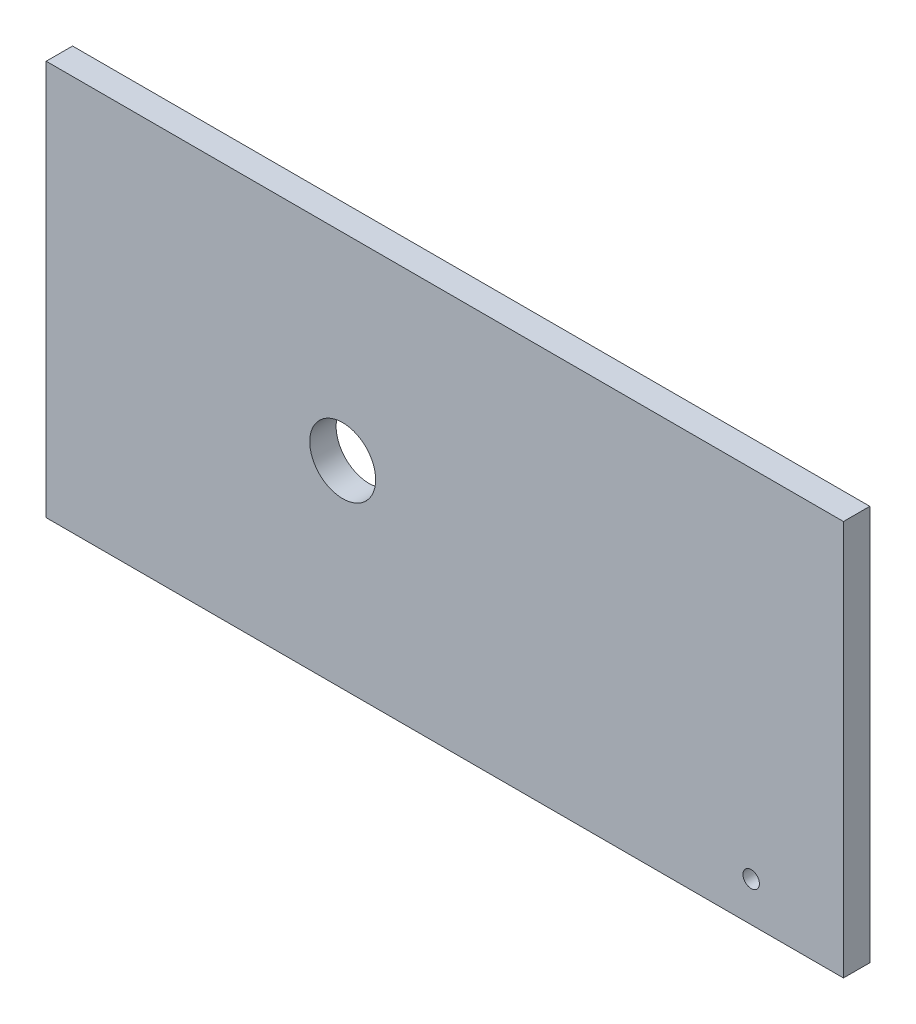
ISO-10303-21;
HEADER;
FILE_DESCRIPTION(('STEP AP214'),'2;1');
FILE_NAME('part.step','',(''),(''),'','','');
FILE_SCHEMA(('AUTOMOTIVE_DESIGN { 1 0 10303 214 1 1 1 1 }'));
ENDSEC;
DATA;
#1=APPLICATION_CONTEXT('core data for automotive mechanical design processes');
#2=APPLICATION_PROTOCOL_DEFINITION('international standard','automotive_design',2000,#1);
#3=PRODUCT_CONTEXT('',#1,'mechanical');
#4=PRODUCT('Part','Part','',(#3));
#5=PRODUCT_RELATED_PRODUCT_CATEGORY('part','',(#4));
#6=PRODUCT_DEFINITION_FORMATION('','',#4);
#7=PRODUCT_DEFINITION_CONTEXT('part definition',#1,'design');
#8=PRODUCT_DEFINITION('design','',#6,#7);
#9=PRODUCT_DEFINITION_SHAPE('','',#8);
#10=(LENGTH_UNIT() NAMED_UNIT(*) SI_UNIT(.MILLI.,.METRE.));
#11=(NAMED_UNIT(*) PLANE_ANGLE_UNIT() SI_UNIT($,.RADIAN.));
#12=(NAMED_UNIT(*) SI_UNIT($,.STERADIAN.) SOLID_ANGLE_UNIT());
#13=UNCERTAINTY_MEASURE_WITH_UNIT(LENGTH_MEASURE(1.E-05),#10,'distance_accuracy_value','');
#14=(GEOMETRIC_REPRESENTATION_CONTEXT(3) GLOBAL_UNCERTAINTY_ASSIGNED_CONTEXT((#13)) GLOBAL_UNIT_ASSIGNED_CONTEXT((#10,
#11,#12)) REPRESENTATION_CONTEXT('',''));
#15=CARTESIAN_POINT('',(0.,0.,0.));
#16=DIRECTION('',(0.,0.,1.));
#17=DIRECTION('',(1.,0.,0.));
#18=AXIS2_PLACEMENT_3D('',#15,#16,#17);
#19=CARTESIAN_POINT('',(0.,0.,4.));
#20=DIRECTION('',(0.,0.,1.));
#21=DIRECTION('',(1.,0.,0.));
#22=AXIS2_PLACEMENT_3D('',#19,#20,#21);
#23=PLANE('',#22);
#24=CARTESIAN_POINT('',(26.,-24.,4.));
#25=DIRECTION('',(0.,0.,1.));
#26=DIRECTION('',(1.,0.,0.));
#27=AXIS2_PLACEMENT_3D('',#24,#25,#26);
#28=CIRCLE('',#27,1.25);
#29=CARTESIAN_POINT('',(27.25,-24.,4.));
#30=VERTEX_POINT('',#29);
#31=EDGE_CURVE('E99',#30,#30,#28,.T.);
#32=ORIENTED_EDGE('',*,*,#31,.F.);
#33=EDGE_LOOP('',(#32));
#34=FACE_BOUND('',#33,.T.);
#35=DIRECTION('',(0.,1.,0.));
#36=VECTOR('',#35,1.);
#37=CARTESIAN_POINT('',(40.,30.,4.));
#38=LINE('',#37,#36);
#39=CARTESIAN_POINT('',(40.,-30.,4.));
#40=VERTEX_POINT('',#39);
#41=CARTESIAN_POINT('',(40.,30.,4.));
#42=VERTEX_POINT('',#41);
#43=EDGE_CURVE('E84',#40,#42,#38,.T.);
#44=ORIENTED_EDGE('',*,*,#43,.T.);
#45=DIRECTION('',(-1.,0.,0.));
#46=VECTOR('',#45,1.);
#47=CARTESIAN_POINT('',(-81.,30.,4.));
#48=LINE('',#47,#46);
#49=CARTESIAN_POINT('',(-81.,30.,4.));
#50=VERTEX_POINT('',#49);
#51=EDGE_CURVE('E79',#42,#50,#48,.T.);
#52=ORIENTED_EDGE('',*,*,#51,.T.);
#53=DIRECTION('',(0.,-1.,0.));
#54=VECTOR('',#53,1.);
#55=CARTESIAN_POINT('',(-81.,-30.,4.));
#56=LINE('',#55,#54);
#57=CARTESIAN_POINT('',(-81.,-30.,4.));
#58=VERTEX_POINT('',#57);
#59=EDGE_CURVE('E82',#50,#58,#56,.T.);
#60=ORIENTED_EDGE('',*,*,#59,.T.);
#61=DIRECTION('',(1.,0.,0.));
#62=VECTOR('',#61,1.);
#63=CARTESIAN_POINT('',(-81.,-30.,4.));
#64=LINE('',#63,#62);
#65=EDGE_CURVE('E49',#58,#40,#64,.T.);
#66=ORIENTED_EDGE('',*,*,#65,.T.);
#67=EDGE_LOOP('',(#44,#52,#60,#66));
#68=FACE_BOUND('',#67,.T.);
#69=CARTESIAN_POINT('',(-36.,0.,4.));
#70=DIRECTION('',(0.,0.,1.));
#71=DIRECTION('',(1.,0.,0.));
#72=AXIS2_PLACEMENT_3D('',#69,#70,#71);
#73=CIRCLE('',#72,5.);
#74=CARTESIAN_POINT('',(-31.,0.,4.));
#75=VERTEX_POINT('',#74);
#76=EDGE_CURVE('E114',#75,#75,#73,.T.);
#77=ORIENTED_EDGE('',*,*,#76,.F.);
#78=EDGE_LOOP('',(#77));
#79=FACE_BOUND('',#78,.T.);
#80=ADVANCED_FACE('F32',(#34,#68,#79),#23,.T.);
#81=CARTESIAN_POINT('',(0.,0.,0.));
#82=DIRECTION('',(0.,0.,1.));
#83=DIRECTION('',(1.,0.,0.));
#84=AXIS2_PLACEMENT_3D('',#81,#82,#83);
#85=PLANE('',#84);
#86=DIRECTION('',(0.,1.,0.));
#87=VECTOR('',#86,1.);
#88=CARTESIAN_POINT('',(40.,30.,0.));
#89=LINE('',#88,#87);
#90=CARTESIAN_POINT('',(40.,-30.,0.));
#91=VERTEX_POINT('',#90);
#92=CARTESIAN_POINT('',(40.,30.,0.));
#93=VERTEX_POINT('',#92);
#94=EDGE_CURVE('E96',#91,#93,#89,.T.);
#95=ORIENTED_EDGE('',*,*,#94,.F.);
#96=DIRECTION('',(1.,0.,0.));
#97=VECTOR('',#96,1.);
#98=CARTESIAN_POINT('',(-81.,-30.,0.));
#99=LINE('',#98,#97);
#100=CARTESIAN_POINT('',(-81.,-30.,0.));
#101=VERTEX_POINT('',#100);
#102=EDGE_CURVE('E72',#101,#91,#99,.T.);
#103=ORIENTED_EDGE('',*,*,#102,.F.);
#104=DIRECTION('',(0.,-1.,0.));
#105=VECTOR('',#104,1.);
#106=CARTESIAN_POINT('',(-81.,-30.,0.));
#107=LINE('',#106,#105);
#108=CARTESIAN_POINT('',(-81.,30.,0.));
#109=VERTEX_POINT('',#108);
#110=EDGE_CURVE('E66',#109,#101,#107,.T.);
#111=ORIENTED_EDGE('',*,*,#110,.F.);
#112=DIRECTION('',(-1.,0.,0.));
#113=VECTOR('',#112,1.);
#114=CARTESIAN_POINT('',(-81.,30.,0.));
#115=LINE('',#114,#113);
#116=EDGE_CURVE('E88',#93,#109,#115,.T.);
#117=ORIENTED_EDGE('',*,*,#116,.F.);
#118=EDGE_LOOP('',(#95,#103,#111,#117));
#119=FACE_BOUND('',#118,.T.);
#120=CARTESIAN_POINT('',(26.,-24.,0.));
#121=DIRECTION('',(0.,0.,1.));
#122=DIRECTION('',(1.,0.,0.));
#123=AXIS2_PLACEMENT_3D('',#120,#121,#122);
#124=CIRCLE('',#123,1.25);
#125=CARTESIAN_POINT('',(27.25,-24.,0.));
#126=VERTEX_POINT('',#125);
#127=EDGE_CURVE('E111',#126,#126,#124,.T.);
#128=ORIENTED_EDGE('',*,*,#127,.T.);
#129=EDGE_LOOP('',(#128));
#130=FACE_BOUND('',#129,.T.);
#131=CARTESIAN_POINT('',(-36.,0.,0.));
#132=DIRECTION('',(0.,0.,1.));
#133=DIRECTION('',(1.,0.,0.));
#134=AXIS2_PLACEMENT_3D('',#131,#132,#133);
#135=CIRCLE('',#134,5.);
#136=CARTESIAN_POINT('',(-31.,0.,0.));
#137=VERTEX_POINT('',#136);
#138=EDGE_CURVE('E117',#137,#137,#135,.T.);
#139=ORIENTED_EDGE('',*,*,#138,.T.);
#140=EDGE_LOOP('',(#139));
#141=FACE_BOUND('',#140,.T.);
#142=ADVANCED_FACE('F107',(#119,#130,#141),#85,.F.);
#143=CARTESIAN_POINT('',(40.,30.,4.));
#144=DIRECTION('',(-1.,0.,0.));
#145=DIRECTION('',(0.,-1.,0.));
#146=AXIS2_PLACEMENT_3D('',#143,#144,#145);
#147=PLANE('',#146);
#148=ORIENTED_EDGE('',*,*,#94,.T.);
#149=DIRECTION('',(0.,0.,-1.));
#150=VECTOR('',#149,1.);
#151=CARTESIAN_POINT('',(40.,30.,4.));
#152=LINE('',#151,#150);
#153=EDGE_CURVE('E11',#42,#93,#152,.T.);
#154=ORIENTED_EDGE('',*,*,#153,.F.);
#155=ORIENTED_EDGE('',*,*,#43,.F.);
#156=DIRECTION('',(0.,0.,-1.));
#157=VECTOR('',#156,1.);
#158=CARTESIAN_POINT('',(40.,-30.,4.));
#159=LINE('',#158,#157);
#160=EDGE_CURVE('E92',#40,#91,#159,.T.);
#161=ORIENTED_EDGE('',*,*,#160,.T.);
#162=EDGE_LOOP('',(#148,#154,#155,#161));
#163=FACE_BOUND('',#162,.T.);
#164=ADVANCED_FACE('F34',(#163),#147,.F.);
#165=CARTESIAN_POINT('',(-81.,30.,4.));
#166=DIRECTION('',(0.,-1.,0.));
#167=DIRECTION('',(0.,0.,-1.));
#168=AXIS2_PLACEMENT_3D('',#165,#166,#167);
#169=PLANE('',#168);
#170=ORIENTED_EDGE('',*,*,#116,.T.);
#171=DIRECTION('',(0.,0.,-1.));
#172=VECTOR('',#171,1.);
#173=CARTESIAN_POINT('',(-81.,30.,4.));
#174=LINE('',#173,#172);
#175=EDGE_CURVE('E41',#50,#109,#174,.T.);
#176=ORIENTED_EDGE('',*,*,#175,.F.);
#177=ORIENTED_EDGE('',*,*,#51,.F.);
#178=ORIENTED_EDGE('',*,*,#153,.T.);
#179=EDGE_LOOP('',(#170,#176,#177,#178));
#180=FACE_BOUND('',#179,.T.);
#181=ADVANCED_FACE('F87',(#180),#169,.F.);
#182=CARTESIAN_POINT('',(-81.,-30.,4.));
#183=DIRECTION('',(1.,0.,0.));
#184=DIRECTION('',(0.,0.,-1.));
#185=AXIS2_PLACEMENT_3D('',#182,#183,#184);
#186=PLANE('',#185);
#187=ORIENTED_EDGE('',*,*,#110,.T.);
#188=DIRECTION('',(0.,0.,-1.));
#189=VECTOR('',#188,1.);
#190=CARTESIAN_POINT('',(-81.,-30.,4.));
#191=LINE('',#190,#189);
#192=EDGE_CURVE('E89',#58,#101,#191,.T.);
#193=ORIENTED_EDGE('',*,*,#192,.F.);
#194=ORIENTED_EDGE('',*,*,#59,.F.);
#195=ORIENTED_EDGE('',*,*,#175,.T.);
#196=EDGE_LOOP('',(#187,#193,#194,#195));
#197=FACE_BOUND('',#196,.T.);
#198=ADVANCED_FACE('F90',(#197),#186,.F.);
#199=CARTESIAN_POINT('',(-81.,-30.,4.));
#200=DIRECTION('',(0.,1.,0.));
#201=DIRECTION('',(0.,0.,1.));
#202=AXIS2_PLACEMENT_3D('',#199,#200,#201);
#203=PLANE('',#202);
#204=ORIENTED_EDGE('',*,*,#102,.T.);
#205=ORIENTED_EDGE('',*,*,#160,.F.);
#206=ORIENTED_EDGE('',*,*,#65,.F.);
#207=ORIENTED_EDGE('',*,*,#192,.T.);
#208=EDGE_LOOP('',(#204,#205,#206,#207));
#209=FACE_BOUND('',#208,.T.);
#210=ADVANCED_FACE('F104',(#209),#203,.F.);
#211=CARTESIAN_POINT('',(26.,-24.,4.));
#212=DIRECTION('',(0.,0.,-1.));
#213=DIRECTION('',(-1.,0.,0.));
#214=AXIS2_PLACEMENT_3D('',#211,#212,#213);
#215=CYLINDRICAL_SURFACE('',#214,1.25);
#216=ORIENTED_EDGE('',*,*,#31,.T.);
#217=EDGE_LOOP('',(#216));
#218=FACE_BOUND('',#217,.T.);
#219=ORIENTED_EDGE('',*,*,#127,.F.);
#220=EDGE_LOOP('',(#219));
#221=FACE_BOUND('',#220,.T.);
#222=ADVANCED_FACE('F134',(#218,#221),#215,.F.);
#223=CARTESIAN_POINT('',(-36.,0.,4.));
#224=DIRECTION('',(0.,0.,-1.));
#225=DIRECTION('',(-1.,0.,0.));
#226=AXIS2_PLACEMENT_3D('',#223,#224,#225);
#227=CYLINDRICAL_SURFACE('',#226,5.);
#228=ORIENTED_EDGE('',*,*,#76,.T.);
#229=EDGE_LOOP('',(#228));
#230=FACE_BOUND('',#229,.T.);
#231=ORIENTED_EDGE('',*,*,#138,.F.);
#232=EDGE_LOOP('',(#231));
#233=FACE_BOUND('',#232,.T.);
#234=ADVANCED_FACE('F123',(#230,#233),#227,.F.);
#235=CLOSED_SHELL('',(#80,#142,#164,#181,#198,#210,#222,#234));
#236=MANIFOLD_SOLID_BREP('B2',#235);
#237=ADVANCED_BREP_SHAPE_REPRESENTATION('',(#18,#236),#14);
#238=SHAPE_DEFINITION_REPRESENTATION(#9,#237);
ENDSEC;
END-ISO-10303-21;
